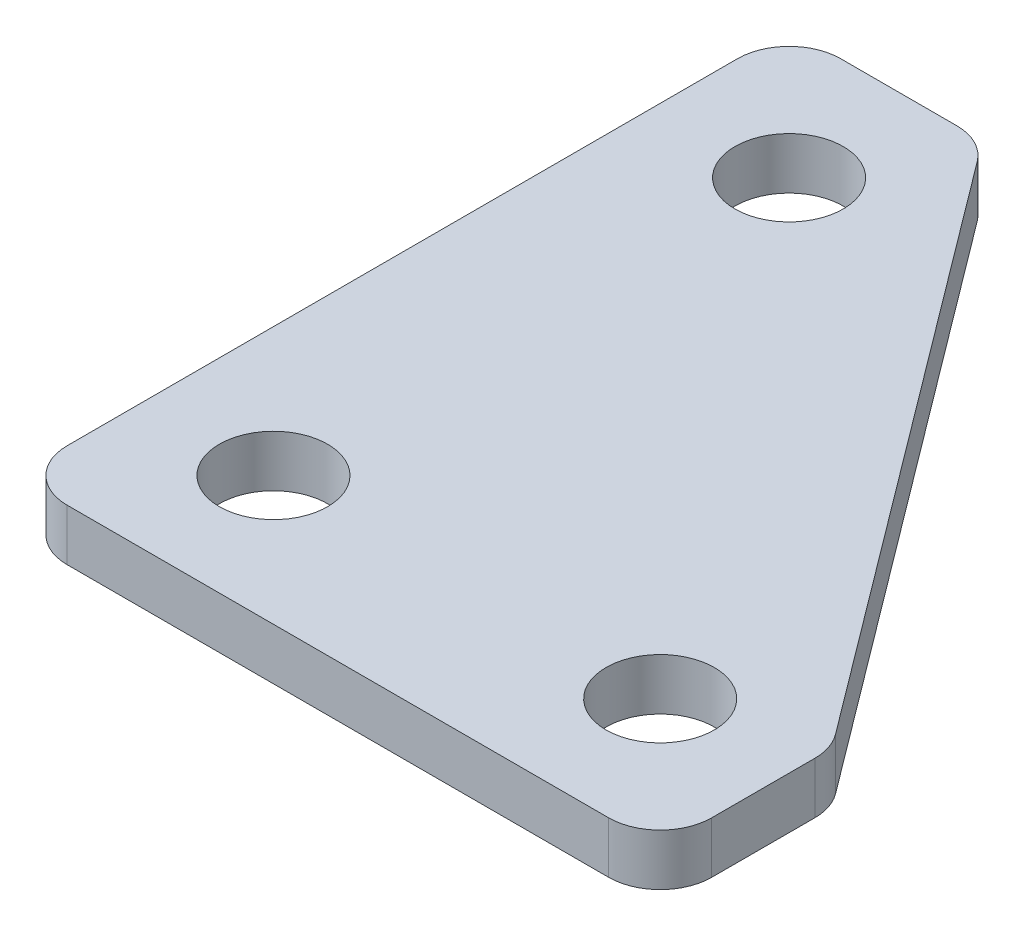
ISO-10303-21;
HEADER;
FILE_DESCRIPTION(('STEP AP214'),'2;1');
FILE_NAME('part.step','',(''),(''),'','','');
FILE_SCHEMA(('AUTOMOTIVE_DESIGN { 1 0 10303 214 1 1 1 1 }'));
ENDSEC;
DATA;
#1=APPLICATION_CONTEXT('core data for automotive mechanical design processes');
#2=APPLICATION_PROTOCOL_DEFINITION('international standard','automotive_design',2000,#1);
#3=PRODUCT_CONTEXT('',#1,'mechanical');
#4=PRODUCT('Part','Part','',(#3));
#5=PRODUCT_RELATED_PRODUCT_CATEGORY('part','',(#4));
#6=PRODUCT_DEFINITION_FORMATION('','',#4);
#7=PRODUCT_DEFINITION_CONTEXT('part definition',#1,'design');
#8=PRODUCT_DEFINITION('design','',#6,#7);
#9=PRODUCT_DEFINITION_SHAPE('','',#8);
#10=(LENGTH_UNIT() NAMED_UNIT(*) SI_UNIT(.MILLI.,.METRE.));
#11=(NAMED_UNIT(*) PLANE_ANGLE_UNIT() SI_UNIT($,.RADIAN.));
#12=(NAMED_UNIT(*) SI_UNIT($,.STERADIAN.) SOLID_ANGLE_UNIT());
#13=UNCERTAINTY_MEASURE_WITH_UNIT(LENGTH_MEASURE(1.E-05),#10,'distance_accuracy_value','');
#14=(GEOMETRIC_REPRESENTATION_CONTEXT(3) GLOBAL_UNCERTAINTY_ASSIGNED_CONTEXT((#13)) GLOBAL_UNIT_ASSIGNED_CONTEXT((#10,
#11,#12)) REPRESENTATION_CONTEXT('',''));
#15=CARTESIAN_POINT('',(0.,0.,0.));
#16=DIRECTION('',(0.,0.,1.));
#17=DIRECTION('',(1.,0.,0.));
#18=AXIS2_PLACEMENT_3D('',#15,#16,#17);
#19=CARTESIAN_POINT('',(-5.,2.,0.));
#20=DIRECTION('',(1.,0.,0.));
#21=DIRECTION('',(0.,0.,-1.));
#22=AXIS2_PLACEMENT_3D('',#19,#20,#21);
#23=PLANE('',#22);
#24=DIRECTION('',(0.,0.,1.));
#25=VECTOR('',#24,1.);
#26=CARTESIAN_POINT('',(-5.,2.,0.));
#27=LINE('',#26,#25);
#28=CARTESIAN_POINT('',(-5.,2.,-23.));
#29=VERTEX_POINT('',#28);
#30=CARTESIAN_POINT('',(-5.,2.,3.));
#31=VERTEX_POINT('',#30);
#32=EDGE_CURVE('E182',#29,#31,#27,.T.);
#33=ORIENTED_EDGE('',*,*,#32,.F.);
#34=DIRECTION('',(0.,-1.,0.));
#35=VECTOR('',#34,1.);
#36=CARTESIAN_POINT('',(-5.,0.,-23.));
#37=LINE('',#36,#35);
#38=CARTESIAN_POINT('',(-5.,0.,-23.));
#39=VERTEX_POINT('',#38);
#40=EDGE_CURVE('E247',#29,#39,#37,.T.);
#41=ORIENTED_EDGE('',*,*,#40,.T.);
#42=DIRECTION('',(0.,0.,1.));
#43=VECTOR('',#42,1.);
#44=CARTESIAN_POINT('',(-5.,0.,0.));
#45=LINE('',#44,#43);
#46=CARTESIAN_POINT('',(-5.,0.,3.));
#47=VERTEX_POINT('',#46);
#48=EDGE_CURVE('E123',#39,#47,#45,.T.);
#49=ORIENTED_EDGE('',*,*,#48,.T.);
#50=DIRECTION('',(0.,-1.,0.));
#51=VECTOR('',#50,1.);
#52=CARTESIAN_POINT('',(-5.,2.,3.));
#53=LINE('',#52,#51);
#54=EDGE_CURVE('E243',#47,#31,#53,.F.);
#55=ORIENTED_EDGE('',*,*,#54,.T.);
#56=EDGE_LOOP('',(#33,#41,#49,#55));
#57=FACE_BOUND('',#56,.T.);
#58=ADVANCED_FACE('F39',(#57),#23,.F.);
#59=CARTESIAN_POINT('',(0.,2.,5.));
#60=DIRECTION('',(0.,0.,-1.));
#61=DIRECTION('',(-1.,0.,0.));
#62=AXIS2_PLACEMENT_3D('',#59,#60,#61);
#63=PLANE('',#62);
#64=DIRECTION('',(1.,0.,0.));
#65=VECTOR('',#64,1.);
#66=CARTESIAN_POINT('',(0.,0.,5.));
#67=LINE('',#66,#65);
#68=CARTESIAN_POINT('',(-3.,0.,5.));
#69=VERTEX_POINT('',#68);
#70=CARTESIAN_POINT('',(18.,0.,5.));
#71=VERTEX_POINT('',#70);
#72=EDGE_CURVE('E216',#69,#71,#67,.T.);
#73=ORIENTED_EDGE('',*,*,#72,.T.);
#74=DIRECTION('',(0.,-1.,0.));
#75=VECTOR('',#74,1.);
#76=CARTESIAN_POINT('',(18.,2.,5.));
#77=LINE('',#76,#75);
#78=CARTESIAN_POINT('',(18.,2.,5.));
#79=VERTEX_POINT('',#78);
#80=EDGE_CURVE('E12',#71,#79,#77,.F.);
#81=ORIENTED_EDGE('',*,*,#80,.T.);
#82=DIRECTION('',(1.,0.,0.));
#83=VECTOR('',#82,1.);
#84=CARTESIAN_POINT('',(0.,2.,5.));
#85=LINE('',#84,#83);
#86=CARTESIAN_POINT('',(-3.,2.,5.));
#87=VERTEX_POINT('',#86);
#88=EDGE_CURVE('E178',#87,#79,#85,.T.);
#89=ORIENTED_EDGE('',*,*,#88,.F.);
#90=DIRECTION('',(0.,-1.,0.));
#91=VECTOR('',#90,1.);
#92=CARTESIAN_POINT('',(-3.,2.,5.));
#93=LINE('',#92,#91);
#94=EDGE_CURVE('E47',#87,#69,#93,.T.);
#95=ORIENTED_EDGE('',*,*,#94,.T.);
#96=EDGE_LOOP('',(#73,#81,#89,#95));
#97=FACE_BOUND('',#96,.T.);
#98=ADVANCED_FACE('F276',(#97),#63,.F.);
#99=CARTESIAN_POINT('',(20.,2.,0.));
#100=DIRECTION('',(1.,0.,0.));
#101=DIRECTION('',(0.,0.,-1.));
#102=AXIS2_PLACEMENT_3D('',#99,#100,#101);
#103=PLANE('',#102);
#104=DIRECTION('',(0.,0.,1.));
#105=VECTOR('',#104,1.);
#106=CARTESIAN_POINT('',(20.,0.,0.));
#107=LINE('',#106,#105);
#108=CARTESIAN_POINT('',(20.,0.,-0.999999999999999));
#109=VERTEX_POINT('',#108);
#110=CARTESIAN_POINT('',(20.,0.,3.));
#111=VERTEX_POINT('',#110);
#112=EDGE_CURVE('E219',#109,#111,#107,.T.);
#113=ORIENTED_EDGE('',*,*,#112,.F.);
#114=DIRECTION('',(0.,-1.,0.));
#115=VECTOR('',#114,1.);
#116=CARTESIAN_POINT('',(20.,2.,-0.999999999999999));
#117=LINE('',#116,#115);
#118=CARTESIAN_POINT('',(20.,2.,-0.999999999999999));
#119=VERTEX_POINT('',#118);
#120=EDGE_CURVE('E61',#109,#119,#117,.F.);
#121=ORIENTED_EDGE('',*,*,#120,.T.);
#122=DIRECTION('',(0.,0.,1.));
#123=VECTOR('',#122,1.);
#124=CARTESIAN_POINT('',(20.,2.,0.));
#125=LINE('',#124,#123);
#126=CARTESIAN_POINT('',(20.,2.,3.));
#127=VERTEX_POINT('',#126);
#128=EDGE_CURVE('E181',#119,#127,#125,.T.);
#129=ORIENTED_EDGE('',*,*,#128,.T.);
#130=DIRECTION('',(0.,-1.,0.));
#131=VECTOR('',#130,1.);
#132=CARTESIAN_POINT('',(20.,0.,3.));
#133=LINE('',#132,#131);
#134=EDGE_CURVE('E200',#127,#111,#133,.T.);
#135=ORIENTED_EDGE('',*,*,#134,.T.);
#136=EDGE_LOOP('',(#113,#121,#129,#135));
#137=FACE_BOUND('',#136,.T.);
#138=ADVANCED_FACE('F252',(#137),#103,.T.);
#139=CARTESIAN_POINT('',(13.6,2.,-10.2));
#140=DIRECTION('',(0.8,0.,-0.6));
#141=DIRECTION('',(-0.6,0.,-0.8));
#142=AXIS2_PLACEMENT_3D('',#139,#140,#141);
#143=PLANE('',#142);
#144=DIRECTION('',(0.6,0.,0.8));
#145=VECTOR('',#144,1.);
#146=CARTESIAN_POINT('',(13.6,0.,-10.2));
#147=LINE('',#146,#145);
#148=CARTESIAN_POINT('',(3.09999999999999,0.,-24.2));
#149=VERTEX_POINT('',#148);
#150=CARTESIAN_POINT('',(19.6,0.,-2.2));
#151=VERTEX_POINT('',#150);
#152=EDGE_CURVE('E140',#149,#151,#147,.T.);
#153=ORIENTED_EDGE('',*,*,#152,.F.);
#154=DIRECTION('',(0.,-1.,0.));
#155=VECTOR('',#154,1.);
#156=CARTESIAN_POINT('',(3.1,2.,-24.2));
#157=LINE('',#156,#155);
#158=CARTESIAN_POINT('',(3.09999999999999,2.,-24.2));
#159=VERTEX_POINT('',#158);
#160=EDGE_CURVE('E163',#149,#159,#157,.F.);
#161=ORIENTED_EDGE('',*,*,#160,.T.);
#162=DIRECTION('',(0.6,0.,0.8));
#163=VECTOR('',#162,1.);
#164=CARTESIAN_POINT('',(13.6,2.,-10.2));
#165=LINE('',#164,#163);
#166=CARTESIAN_POINT('',(19.6,2.,-2.2));
#167=VERTEX_POINT('',#166);
#168=EDGE_CURVE('E186',#159,#167,#165,.T.);
#169=ORIENTED_EDGE('',*,*,#168,.T.);
#170=DIRECTION('',(0.,-1.,0.));
#171=VECTOR('',#170,1.);
#172=CARTESIAN_POINT('',(19.6,2.,-2.2));
#173=LINE('',#172,#171);
#174=EDGE_CURVE('E160',#167,#151,#173,.T.);
#175=ORIENTED_EDGE('',*,*,#174,.T.);
#176=EDGE_LOOP('',(#153,#161,#169,#175));
#177=FACE_BOUND('',#176,.T.);
#178=ADVANCED_FACE('F261',(#177),#143,.T.);
#179=CARTESIAN_POINT('',(0.,2.,0.));
#180=DIRECTION('',(0.,-1.,0.));
#181=DIRECTION('',(0.,0.,-1.));
#182=AXIS2_PLACEMENT_3D('',#179,#180,#181);
#183=CYLINDRICAL_SURFACE('',#182,2.1);
#184=CARTESIAN_POINT('',(0.,2.,0.));
#185=DIRECTION('',(0.,1.,0.));
#186=DIRECTION('',(0.,0.,1.));
#187=AXIS2_PLACEMENT_3D('',#184,#185,#186);
#188=CIRCLE('',#187,2.1);
#189=CARTESIAN_POINT('',(0.,2.,2.1));
#190=VERTEX_POINT('',#189);
#191=EDGE_CURVE('E150',#190,#190,#188,.T.);
#192=ORIENTED_EDGE('',*,*,#191,.T.);
#193=EDGE_LOOP('',(#192));
#194=FACE_BOUND('',#193,.T.);
#195=CARTESIAN_POINT('',(0.,0.,0.));
#196=DIRECTION('',(0.,1.,0.));
#197=DIRECTION('',(0.,0.,1.));
#198=AXIS2_PLACEMENT_3D('',#195,#196,#197);
#199=CIRCLE('',#198,2.1);
#200=CARTESIAN_POINT('',(0.,0.,2.1));
#201=VERTEX_POINT('',#200);
#202=EDGE_CURVE('E225',#201,#201,#199,.T.);
#203=ORIENTED_EDGE('',*,*,#202,.F.);
#204=EDGE_LOOP('',(#203));
#205=FACE_BOUND('',#204,.T.);
#206=ADVANCED_FACE('F286',(#194,#205),#183,.F.);
#207=CARTESIAN_POINT('',(15.,2.,0.));
#208=DIRECTION('',(0.,-1.,0.));
#209=DIRECTION('',(0.,0.,-1.));
#210=AXIS2_PLACEMENT_3D('',#207,#208,#209);
#211=CYLINDRICAL_SURFACE('',#210,2.1);
#212=CARTESIAN_POINT('',(15.,2.,0.));
#213=DIRECTION('',(0.,1.,0.));
#214=DIRECTION('',(0.,0.,1.));
#215=AXIS2_PLACEMENT_3D('',#212,#213,#214);
#216=CIRCLE('',#215,2.1);
#217=CARTESIAN_POINT('',(15.,2.,2.1));
#218=VERTEX_POINT('',#217);
#219=EDGE_CURVE('E207',#218,#218,#216,.T.);
#220=ORIENTED_EDGE('',*,*,#219,.T.);
#221=EDGE_LOOP('',(#220));
#222=FACE_BOUND('',#221,.T.);
#223=CARTESIAN_POINT('',(15.,0.,0.));
#224=DIRECTION('',(0.,1.,0.));
#225=DIRECTION('',(0.,0.,1.));
#226=AXIS2_PLACEMENT_3D('',#223,#224,#225);
#227=CIRCLE('',#226,2.1);
#228=CARTESIAN_POINT('',(15.,0.,2.1));
#229=VERTEX_POINT('',#228);
#230=EDGE_CURVE('E139',#229,#229,#227,.T.);
#231=ORIENTED_EDGE('',*,*,#230,.F.);
#232=EDGE_LOOP('',(#231));
#233=FACE_BOUND('',#232,.T.);
#234=ADVANCED_FACE('F290',(#222,#233),#211,.F.);
#235=CARTESIAN_POINT('',(0.,2.,-25.));
#236=DIRECTION('',(0.,0.,-1.));
#237=DIRECTION('',(-1.,0.,0.));
#238=AXIS2_PLACEMENT_3D('',#235,#236,#237);
#239=PLANE('',#238);
#240=DIRECTION('',(1.,0.,0.));
#241=VECTOR('',#240,1.);
#242=CARTESIAN_POINT('',(0.,2.,-25.));
#243=LINE('',#242,#241);
#244=CARTESIAN_POINT('',(-3.,2.,-25.));
#245=VERTEX_POINT('',#244);
#246=CARTESIAN_POINT('',(1.5,2.,-25.));
#247=VERTEX_POINT('',#246);
#248=EDGE_CURVE('E205',#245,#247,#243,.T.);
#249=ORIENTED_EDGE('',*,*,#248,.T.);
#250=DIRECTION('',(0.,-1.,0.));
#251=VECTOR('',#250,1.);
#252=CARTESIAN_POINT('',(1.5,2.,-25.));
#253=LINE('',#252,#251);
#254=CARTESIAN_POINT('',(1.5,0.,-25.));
#255=VERTEX_POINT('',#254);
#256=EDGE_CURVE('E138',#247,#255,#253,.T.);
#257=ORIENTED_EDGE('',*,*,#256,.T.);
#258=DIRECTION('',(1.,0.,0.));
#259=VECTOR('',#258,1.);
#260=CARTESIAN_POINT('',(0.,0.,-25.));
#261=LINE('',#260,#259);
#262=CARTESIAN_POINT('',(-3.,0.,-25.));
#263=VERTEX_POINT('',#262);
#264=EDGE_CURVE('E121',#263,#255,#261,.T.);
#265=ORIENTED_EDGE('',*,*,#264,.F.);
#266=DIRECTION('',(0.,-1.,0.));
#267=VECTOR('',#266,1.);
#268=CARTESIAN_POINT('',(-3.,2.,-25.));
#269=LINE('',#268,#267);
#270=EDGE_CURVE('E135',#263,#245,#269,.F.);
#271=ORIENTED_EDGE('',*,*,#270,.T.);
#272=EDGE_LOOP('',(#249,#257,#265,#271));
#273=FACE_BOUND('',#272,.T.);
#274=ADVANCED_FACE('F134',(#273),#239,.T.);
#275=CARTESIAN_POINT('',(0.,2.,-20.));
#276=DIRECTION('',(0.,-1.,0.));
#277=DIRECTION('',(0.,0.,-1.));
#278=AXIS2_PLACEMENT_3D('',#275,#276,#277);
#279=CYLINDRICAL_SURFACE('',#278,2.1);
#280=CARTESIAN_POINT('',(0.,2.,-20.));
#281=DIRECTION('',(0.,1.,0.));
#282=DIRECTION('',(0.,0.,1.));
#283=AXIS2_PLACEMENT_3D('',#280,#281,#282);
#284=CIRCLE('',#283,2.1);
#285=CARTESIAN_POINT('',(0.,2.,-17.9));
#286=VERTEX_POINT('',#285);
#287=EDGE_CURVE('E145',#286,#286,#284,.T.);
#288=ORIENTED_EDGE('',*,*,#287,.T.);
#289=EDGE_LOOP('',(#288));
#290=FACE_BOUND('',#289,.T.);
#291=CARTESIAN_POINT('',(0.,0.,-20.));
#292=DIRECTION('',(0.,1.,0.));
#293=DIRECTION('',(0.,0.,1.));
#294=AXIS2_PLACEMENT_3D('',#291,#292,#293);
#295=CIRCLE('',#294,2.1);
#296=CARTESIAN_POINT('',(0.,0.,-17.9));
#297=VERTEX_POINT('',#296);
#298=EDGE_CURVE('E152',#297,#297,#295,.T.);
#299=ORIENTED_EDGE('',*,*,#298,.F.);
#300=EDGE_LOOP('',(#299));
#301=FACE_BOUND('',#300,.T.);
#302=ADVANCED_FACE('F289',(#290,#301),#279,.F.);
#303=CARTESIAN_POINT('',(0.,2.,0.));
#304=DIRECTION('',(0.,1.,0.));
#305=DIRECTION('',(0.,0.,1.));
#306=AXIS2_PLACEMENT_3D('',#303,#304,#305);
#307=PLANE('',#306);
#308=ORIENTED_EDGE('',*,*,#168,.F.);
#309=CARTESIAN_POINT('',(1.5,2.,-23.));
#310=DIRECTION('',(0.,1.,0.));
#311=DIRECTION('',(0.,0.,1.));
#312=AXIS2_PLACEMENT_3D('',#309,#310,#311);
#313=CIRCLE('',#312,2.);
#314=EDGE_CURVE('E196',#159,#247,#313,.T.);
#315=ORIENTED_EDGE('',*,*,#314,.T.);
#316=ORIENTED_EDGE('',*,*,#248,.F.);
#317=CARTESIAN_POINT('',(-3.,2.,-23.));
#318=DIRECTION('',(0.,1.,0.));
#319=DIRECTION('',(0.,0.,1.));
#320=AXIS2_PLACEMENT_3D('',#317,#318,#319);
#321=CIRCLE('',#320,2.);
#322=EDGE_CURVE('E144',#245,#29,#321,.T.);
#323=ORIENTED_EDGE('',*,*,#322,.T.);
#324=ORIENTED_EDGE('',*,*,#32,.T.);
#325=CARTESIAN_POINT('',(-3.,2.,3.));
#326=DIRECTION('',(0.,1.,0.));
#327=DIRECTION('',(0.,0.,1.));
#328=AXIS2_PLACEMENT_3D('',#325,#326,#327);
#329=CIRCLE('',#328,2.);
#330=EDGE_CURVE('E165',#31,#87,#329,.T.);
#331=ORIENTED_EDGE('',*,*,#330,.T.);
#332=ORIENTED_EDGE('',*,*,#88,.T.);
#333=CARTESIAN_POINT('',(18.,2.,3.));
#334=DIRECTION('',(0.,1.,0.));
#335=DIRECTION('',(0.,0.,1.));
#336=AXIS2_PLACEMENT_3D('',#333,#334,#335);
#337=CIRCLE('',#336,2.);
#338=EDGE_CURVE('E54',#79,#127,#337,.T.);
#339=ORIENTED_EDGE('',*,*,#338,.T.);
#340=ORIENTED_EDGE('',*,*,#128,.F.);
#341=CARTESIAN_POINT('',(18.,2.,-0.999999999999999));
#342=DIRECTION('',(0.,1.,0.));
#343=DIRECTION('',(0.,0.,1.));
#344=AXIS2_PLACEMENT_3D('',#341,#342,#343);
#345=CIRCLE('',#344,2.);
#346=EDGE_CURVE('E193',#119,#167,#345,.T.);
#347=ORIENTED_EDGE('',*,*,#346,.T.);
#348=EDGE_LOOP('',(#308,#315,#316,#323,#324,#331,#332,#339,#340,#347));
#349=FACE_BOUND('',#348,.T.);
#350=ORIENTED_EDGE('',*,*,#219,.F.);
#351=EDGE_LOOP('',(#350));
#352=FACE_BOUND('',#351,.T.);
#353=ORIENTED_EDGE('',*,*,#191,.F.);
#354=EDGE_LOOP('',(#353));
#355=FACE_BOUND('',#354,.T.);
#356=ORIENTED_EDGE('',*,*,#287,.F.);
#357=EDGE_LOOP('',(#356));
#358=FACE_BOUND('',#357,.T.);
#359=ADVANCED_FACE('F236',(#349,#352,#355,#358),#307,.T.);
#360=CARTESIAN_POINT('',(0.,0.,0.));
#361=DIRECTION('',(0.,1.,0.));
#362=DIRECTION('',(0.,0.,1.));
#363=AXIS2_PLACEMENT_3D('',#360,#361,#362);
#364=PLANE('',#363);
#365=ORIENTED_EDGE('',*,*,#264,.T.);
#366=CARTESIAN_POINT('',(1.5,0.,-23.));
#367=DIRECTION('',(0.,1.,0.));
#368=DIRECTION('',(0.,0.,1.));
#369=AXIS2_PLACEMENT_3D('',#366,#367,#368);
#370=CIRCLE('',#369,2.);
#371=EDGE_CURVE('E158',#255,#149,#370,.F.);
#372=ORIENTED_EDGE('',*,*,#371,.T.);
#373=ORIENTED_EDGE('',*,*,#152,.T.);
#374=CARTESIAN_POINT('',(18.,0.,-0.999999999999999));
#375=DIRECTION('',(0.,1.,0.));
#376=DIRECTION('',(0.,0.,1.));
#377=AXIS2_PLACEMENT_3D('',#374,#375,#376);
#378=CIRCLE('',#377,2.);
#379=EDGE_CURVE('E128',#151,#109,#378,.F.);
#380=ORIENTED_EDGE('',*,*,#379,.T.);
#381=ORIENTED_EDGE('',*,*,#112,.T.);
#382=CARTESIAN_POINT('',(18.,0.,3.));
#383=DIRECTION('',(0.,1.,0.));
#384=DIRECTION('',(0.,0.,1.));
#385=AXIS2_PLACEMENT_3D('',#382,#383,#384);
#386=CIRCLE('',#385,2.);
#387=EDGE_CURVE('E129',#111,#71,#386,.F.);
#388=ORIENTED_EDGE('',*,*,#387,.T.);
#389=ORIENTED_EDGE('',*,*,#72,.F.);
#390=CARTESIAN_POINT('',(-3.,0.,3.));
#391=DIRECTION('',(0.,1.,0.));
#392=DIRECTION('',(0.,0.,1.));
#393=AXIS2_PLACEMENT_3D('',#390,#391,#392);
#394=CIRCLE('',#393,2.);
#395=EDGE_CURVE('E147',#69,#47,#394,.F.);
#396=ORIENTED_EDGE('',*,*,#395,.T.);
#397=ORIENTED_EDGE('',*,*,#48,.F.);
#398=CARTESIAN_POINT('',(-3.,0.,-23.));
#399=DIRECTION('',(0.,1.,0.));
#400=DIRECTION('',(0.,0.,1.));
#401=AXIS2_PLACEMENT_3D('',#398,#399,#400);
#402=CIRCLE('',#401,2.);
#403=EDGE_CURVE('E117',#39,#263,#402,.F.);
#404=ORIENTED_EDGE('',*,*,#403,.T.);
#405=EDGE_LOOP('',(#365,#372,#373,#380,#381,#388,#389,#396,#397,#404));
#406=FACE_BOUND('',#405,.T.);
#407=ORIENTED_EDGE('',*,*,#230,.T.);
#408=EDGE_LOOP('',(#407));
#409=FACE_BOUND('',#408,.T.);
#410=ORIENTED_EDGE('',*,*,#202,.T.);
#411=EDGE_LOOP('',(#410));
#412=FACE_BOUND('',#411,.T.);
#413=ORIENTED_EDGE('',*,*,#298,.T.);
#414=EDGE_LOOP('',(#413));
#415=FACE_BOUND('',#414,.T.);
#416=ADVANCED_FACE('F119',(#406,#409,#412,#415),#364,.F.);
#417=CARTESIAN_POINT('',(1.5,2.,-23.));
#418=DIRECTION('',(0.,-1.,0.));
#419=DIRECTION('',(0.,0.,-1.));
#420=AXIS2_PLACEMENT_3D('',#417,#418,#419);
#421=CYLINDRICAL_SURFACE('',#420,2.);
#422=ORIENTED_EDGE('',*,*,#314,.F.);
#423=ORIENTED_EDGE('',*,*,#160,.F.);
#424=ORIENTED_EDGE('',*,*,#371,.F.);
#425=ORIENTED_EDGE('',*,*,#256,.F.);
#426=EDGE_LOOP('',(#422,#423,#424,#425));
#427=FACE_BOUND('',#426,.T.);
#428=ADVANCED_FACE('F265',(#427),#421,.T.);
#429=CARTESIAN_POINT('',(18.,2.,-0.999999999999999));
#430=DIRECTION('',(0.,-1.,0.));
#431=DIRECTION('',(0.,0.,-1.));
#432=AXIS2_PLACEMENT_3D('',#429,#430,#431);
#433=CYLINDRICAL_SURFACE('',#432,2.);
#434=ORIENTED_EDGE('',*,*,#346,.F.);
#435=ORIENTED_EDGE('',*,*,#120,.F.);
#436=ORIENTED_EDGE('',*,*,#379,.F.);
#437=ORIENTED_EDGE('',*,*,#174,.F.);
#438=EDGE_LOOP('',(#434,#435,#436,#437));
#439=FACE_BOUND('',#438,.T.);
#440=ADVANCED_FACE('F258',(#439),#433,.T.);
#441=CARTESIAN_POINT('',(-3.,2.,-23.));
#442=DIRECTION('',(0.,1.,0.));
#443=DIRECTION('',(0.,0.,1.));
#444=AXIS2_PLACEMENT_3D('',#441,#442,#443);
#445=CYLINDRICAL_SURFACE('',#444,2.);
#446=ORIENTED_EDGE('',*,*,#322,.F.);
#447=ORIENTED_EDGE('',*,*,#270,.F.);
#448=ORIENTED_EDGE('',*,*,#403,.F.);
#449=ORIENTED_EDGE('',*,*,#40,.F.);
#450=EDGE_LOOP('',(#446,#447,#448,#449));
#451=FACE_BOUND('',#450,.T.);
#452=ADVANCED_FACE('F143',(#451),#445,.T.);
#453=CARTESIAN_POINT('',(18.,2.,3.));
#454=DIRECTION('',(0.,1.,0.));
#455=DIRECTION('',(0.,0.,1.));
#456=AXIS2_PLACEMENT_3D('',#453,#454,#455);
#457=CYLINDRICAL_SURFACE('',#456,2.);
#458=ORIENTED_EDGE('',*,*,#338,.F.);
#459=ORIENTED_EDGE('',*,*,#80,.F.);
#460=ORIENTED_EDGE('',*,*,#387,.F.);
#461=ORIENTED_EDGE('',*,*,#134,.F.);
#462=EDGE_LOOP('',(#458,#459,#460,#461));
#463=FACE_BOUND('',#462,.T.);
#464=ADVANCED_FACE('F330',(#463),#457,.T.);
#465=CARTESIAN_POINT('',(-3.,2.,3.));
#466=DIRECTION('',(0.,-1.,0.));
#467=DIRECTION('',(0.,0.,-1.));
#468=AXIS2_PLACEMENT_3D('',#465,#466,#467);
#469=CYLINDRICAL_SURFACE('',#468,2.);
#470=ORIENTED_EDGE('',*,*,#330,.F.);
#471=ORIENTED_EDGE('',*,*,#54,.F.);
#472=ORIENTED_EDGE('',*,*,#395,.F.);
#473=ORIENTED_EDGE('',*,*,#94,.F.);
#474=EDGE_LOOP('',(#470,#471,#472,#473));
#475=FACE_BOUND('',#474,.T.);
#476=ADVANCED_FACE('F41',(#475),#469,.T.);
#477=CLOSED_SHELL('',(#58,#98,#138,#178,#206,#234,#274,#302,#359,#416,#428,#440,#452,#464,#476));
#478=MANIFOLD_SOLID_BREP('B2',#477);
#479=ADVANCED_BREP_SHAPE_REPRESENTATION('',(#18,#478),#14);
#480=SHAPE_DEFINITION_REPRESENTATION(#9,#479);
ENDSEC;
END-ISO-10303-21;
